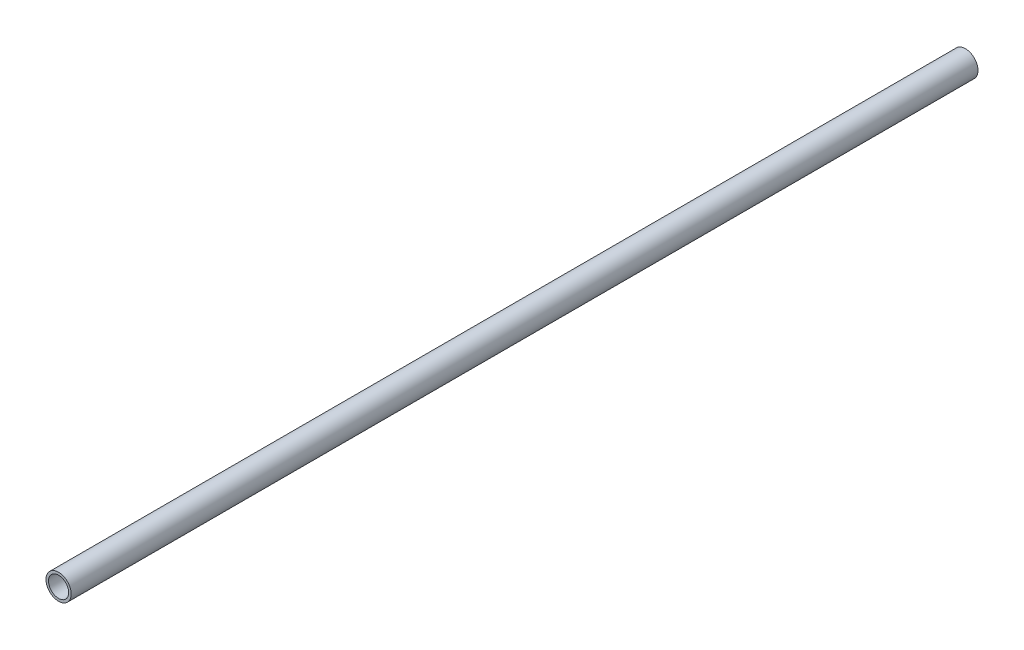
ISO-10303-21;
HEADER;
FILE_DESCRIPTION(('STEP AP214'),'2;1');
FILE_NAME('part.step','',(''),(''),'','','');
FILE_SCHEMA(('AUTOMOTIVE_DESIGN { 1 0 10303 214 1 1 1 1 }'));
ENDSEC;
DATA;
#1=APPLICATION_CONTEXT('core data for automotive mechanical design processes');
#2=APPLICATION_PROTOCOL_DEFINITION('international standard','automotive_design',2000,#1);
#3=PRODUCT_CONTEXT('',#1,'mechanical');
#4=PRODUCT('Part','Part','',(#3));
#5=PRODUCT_RELATED_PRODUCT_CATEGORY('part','',(#4));
#6=PRODUCT_DEFINITION_FORMATION('','',#4);
#7=PRODUCT_DEFINITION_CONTEXT('part definition',#1,'design');
#8=PRODUCT_DEFINITION('design','',#6,#7);
#9=PRODUCT_DEFINITION_SHAPE('','',#8);
#10=(LENGTH_UNIT() NAMED_UNIT(*) SI_UNIT(.MILLI.,.METRE.));
#11=(NAMED_UNIT(*) PLANE_ANGLE_UNIT() SI_UNIT($,.RADIAN.));
#12=(NAMED_UNIT(*) SI_UNIT($,.STERADIAN.) SOLID_ANGLE_UNIT());
#13=UNCERTAINTY_MEASURE_WITH_UNIT(LENGTH_MEASURE(1.E-05),#10,'distance_accuracy_value','');
#14=(GEOMETRIC_REPRESENTATION_CONTEXT(3) GLOBAL_UNCERTAINTY_ASSIGNED_CONTEXT((#13)) GLOBAL_UNIT_ASSIGNED_CONTEXT((#10,
#11,#12)) REPRESENTATION_CONTEXT('',''));
#15=CARTESIAN_POINT('',(0.,0.,0.));
#16=DIRECTION('',(0.,0.,1.));
#17=DIRECTION('',(1.,0.,0.));
#18=AXIS2_PLACEMENT_3D('',#15,#16,#17);
#19=CARTESIAN_POINT('',(0.,0.,228.6));
#20=DIRECTION('',(0.,0.,1.));
#21=DIRECTION('',(1.,0.,0.));
#22=AXIS2_PLACEMENT_3D('',#19,#20,#21);
#23=PLANE('',#22);
#24=CARTESIAN_POINT('',(0.,0.,228.6));
#25=DIRECTION('',(0.,0.,1.));
#26=DIRECTION('',(1.,0.,0.));
#27=AXIS2_PLACEMENT_3D('',#24,#25,#26);
#28=CIRCLE('',#27,3.175);
#29=CARTESIAN_POINT('',(3.175,0.,228.6));
#30=VERTEX_POINT('',#29);
#31=EDGE_CURVE('E10',#30,#30,#28,.T.);
#32=ORIENTED_EDGE('',*,*,#31,.T.);
#33=EDGE_LOOP('',(#32));
#34=FACE_BOUND('',#33,.T.);
#35=CARTESIAN_POINT('',(0.,0.,228.6));
#36=DIRECTION('',(0.,0.,1.));
#37=DIRECTION('',(1.,0.,0.));
#38=AXIS2_PLACEMENT_3D('',#35,#36,#37);
#39=CIRCLE('',#38,2.54);
#40=CARTESIAN_POINT('',(2.54,0.,228.6));
#41=VERTEX_POINT('',#40);
#42=EDGE_CURVE('E42',#41,#41,#39,.T.);
#43=ORIENTED_EDGE('',*,*,#42,.F.);
#44=EDGE_LOOP('',(#43));
#45=FACE_BOUND('',#44,.T.);
#46=ADVANCED_FACE('F31',(#34,#45),#23,.T.);
#47=CARTESIAN_POINT('',(0.,0.,0.));
#48=DIRECTION('',(0.,0.,1.));
#49=DIRECTION('',(1.,0.,0.));
#50=AXIS2_PLACEMENT_3D('',#47,#48,#49);
#51=PLANE('',#50);
#52=CARTESIAN_POINT('',(0.,0.,0.));
#53=DIRECTION('',(0.,0.,1.));
#54=DIRECTION('',(1.,0.,0.));
#55=AXIS2_PLACEMENT_3D('',#52,#53,#54);
#56=CIRCLE('',#55,3.175);
#57=CARTESIAN_POINT('',(3.175,0.,0.));
#58=VERTEX_POINT('',#57);
#59=EDGE_CURVE('E35',#58,#58,#56,.T.);
#60=ORIENTED_EDGE('',*,*,#59,.F.);
#61=EDGE_LOOP('',(#60));
#62=FACE_BOUND('',#61,.T.);
#63=CARTESIAN_POINT('',(0.,0.,0.));
#64=DIRECTION('',(0.,0.,1.));
#65=DIRECTION('',(1.,0.,0.));
#66=AXIS2_PLACEMENT_3D('',#63,#64,#65);
#67=CIRCLE('',#66,2.54);
#68=CARTESIAN_POINT('',(2.54,0.,0.));
#69=VERTEX_POINT('',#68);
#70=EDGE_CURVE('E44',#69,#69,#67,.T.);
#71=ORIENTED_EDGE('',*,*,#70,.T.);
#72=EDGE_LOOP('',(#71));
#73=FACE_BOUND('',#72,.T.);
#74=ADVANCED_FACE('F54',(#62,#73),#51,.F.);
#75=CARTESIAN_POINT('',(0.,0.,228.6));
#76=DIRECTION('',(0.,0.,-1.));
#77=DIRECTION('',(-1.,0.,0.));
#78=AXIS2_PLACEMENT_3D('',#75,#76,#77);
#79=CYLINDRICAL_SURFACE('',#78,3.175);
#80=ORIENTED_EDGE('',*,*,#31,.F.);
#81=EDGE_LOOP('',(#80));
#82=FACE_BOUND('',#81,.T.);
#83=ORIENTED_EDGE('',*,*,#59,.T.);
#84=EDGE_LOOP('',(#83));
#85=FACE_BOUND('',#84,.T.);
#86=ADVANCED_FACE('F33',(#82,#85),#79,.T.);
#87=CARTESIAN_POINT('',(0.,0.,228.6));
#88=DIRECTION('',(0.,0.,-1.));
#89=DIRECTION('',(-1.,0.,0.));
#90=AXIS2_PLACEMENT_3D('',#87,#88,#89);
#91=CYLINDRICAL_SURFACE('',#90,2.54);
#92=ORIENTED_EDGE('',*,*,#42,.T.);
#93=EDGE_LOOP('',(#92));
#94=FACE_BOUND('',#93,.T.);
#95=ORIENTED_EDGE('',*,*,#70,.F.);
#96=EDGE_LOOP('',(#95));
#97=FACE_BOUND('',#96,.T.);
#98=ADVANCED_FACE('F50',(#94,#97),#91,.F.);
#99=CLOSED_SHELL('',(#46,#74,#86,#98));
#100=MANIFOLD_SOLID_BREP('B2',#99);
#101=ADVANCED_BREP_SHAPE_REPRESENTATION('',(#18,#100),#14);
#102=SHAPE_DEFINITION_REPRESENTATION(#9,#101);
ENDSEC;
END-ISO-10303-21;
